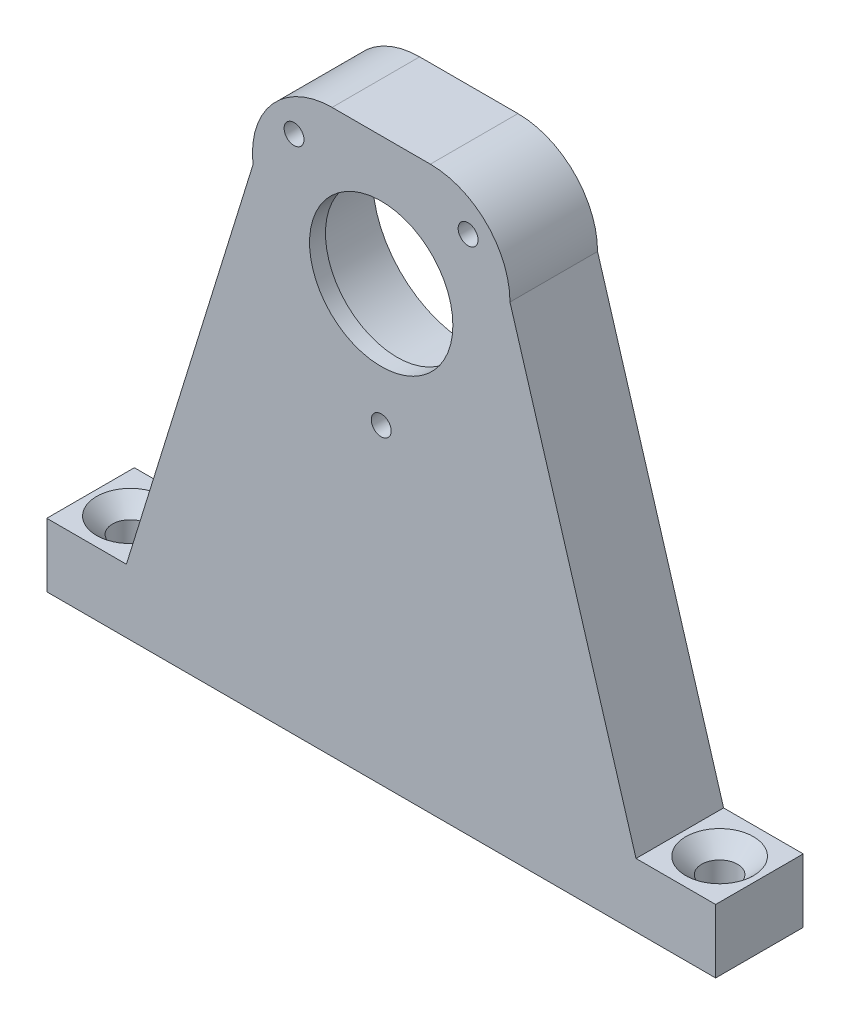
ISO-10303-21;
HEADER;
FILE_DESCRIPTION(('STEP AP214'),'2;1');
FILE_NAME('part.step','',(''),(''),'','','');
FILE_SCHEMA(('AUTOMOTIVE_DESIGN { 1 0 10303 214 1 1 1 1 }'));
ENDSEC;
DATA;
#1=APPLICATION_CONTEXT('core data for automotive mechanical design processes');
#2=APPLICATION_PROTOCOL_DEFINITION('international standard','automotive_design',2000,#1);
#3=PRODUCT_CONTEXT('',#1,'mechanical');
#4=PRODUCT('Part','Part','',(#3));
#5=PRODUCT_RELATED_PRODUCT_CATEGORY('part','',(#4));
#6=PRODUCT_DEFINITION_FORMATION('','',#4);
#7=PRODUCT_DEFINITION_CONTEXT('part definition',#1,'design');
#8=PRODUCT_DEFINITION('design','',#6,#7);
#9=PRODUCT_DEFINITION_SHAPE('','',#8);
#10=(LENGTH_UNIT() NAMED_UNIT(*) SI_UNIT(.MILLI.,.METRE.));
#11=(NAMED_UNIT(*) PLANE_ANGLE_UNIT() SI_UNIT($,.RADIAN.));
#12=(NAMED_UNIT(*) SI_UNIT($,.STERADIAN.) SOLID_ANGLE_UNIT());
#13=UNCERTAINTY_MEASURE_WITH_UNIT(LENGTH_MEASURE(1.E-05),#10,'distance_accuracy_value','');
#14=(GEOMETRIC_REPRESENTATION_CONTEXT(3) GLOBAL_UNCERTAINTY_ASSIGNED_CONTEXT((#13)) GLOBAL_UNIT_ASSIGNED_CONTEXT((#10,
#11,#12)) REPRESENTATION_CONTEXT('',''));
#15=CARTESIAN_POINT('',(0.,0.,0.));
#16=DIRECTION('',(0.,0.,1.));
#17=DIRECTION('',(1.,0.,0.));
#18=AXIS2_PLACEMENT_3D('',#15,#16,#17);
#19=CARTESIAN_POINT('',(0.,0.,11.));
#20=DIRECTION('',(0.,0.,-1.));
#21=DIRECTION('',(-1.,0.,0.));
#22=AXIS2_PLACEMENT_3D('',#19,#20,#21);
#23=CYLINDRICAL_SURFACE('',#22,12.1);
#24=CARTESIAN_POINT('',(0.,0.,0.));
#25=DIRECTION('',(0.,0.,1.));
#26=DIRECTION('',(1.,0.,0.));
#27=AXIS2_PLACEMENT_3D('',#24,#25,#26);
#28=CIRCLE('',#27,12.1);
#29=CARTESIAN_POINT('',(12.1,0.,0.));
#30=VERTEX_POINT('',#29);
#31=EDGE_CURVE('E158',#30,#30,#28,.T.);
#32=ORIENTED_EDGE('',*,*,#31,.F.);
#33=EDGE_LOOP('',(#32));
#34=FACE_BOUND('',#33,.T.);
#35=CARTESIAN_POINT('',(0.,0.,9.));
#36=DIRECTION('',(0.,0.,1.));
#37=DIRECTION('',(1.,0.,0.));
#38=AXIS2_PLACEMENT_3D('',#35,#36,#37);
#39=CIRCLE('',#38,12.1);
#40=CARTESIAN_POINT('',(12.1,0.,9.));
#41=VERTEX_POINT('',#40);
#42=EDGE_CURVE('E303',#41,#41,#39,.T.);
#43=ORIENTED_EDGE('',*,*,#42,.T.);
#44=EDGE_LOOP('',(#43));
#45=FACE_BOUND('',#44,.T.);
#46=ADVANCED_FACE('F38',(#34,#45),#23,.F.);
#47=CARTESIAN_POINT('',(6.17131132464449,6.1,11.));
#48=DIRECTION('',(0.,0.,1.));
#49=DIRECTION('',(1.,0.,0.));
#50=AXIS2_PLACEMENT_3D('',#47,#48,#49);
#51=PLANE('',#50);
#52=CARTESIAN_POINT('',(10.9107197436623,10.8519646008193,11.));
#53=DIRECTION('',(0.,0.,-1.));
#54=DIRECTION('',(-1.,0.,0.));
#55=AXIS2_PLACEMENT_3D('',#52,#53,#54);
#56=CIRCLE('',#55,1.25);
#57=CARTESIAN_POINT('',(9.66071974366226,10.8519646008193,11.));
#58=VERTEX_POINT('',#57);
#59=EDGE_CURVE('E316',#58,#58,#56,.T.);
#60=ORIENTED_EDGE('',*,*,#59,.T.);
#61=EDGE_LOOP('',(#60));
#62=FACE_BOUND('',#61,.T.);
#63=CARTESIAN_POINT('',(-10.9444590620381,10.8179926058548,11.));
#64=DIRECTION('',(0.,0.,-1.));
#65=DIRECTION('',(-1.,0.,0.));
#66=AXIS2_PLACEMENT_3D('',#63,#64,#65);
#67=CIRCLE('',#66,1.25);
#68=CARTESIAN_POINT('',(-12.1944590620381,10.8179926058548,11.));
#69=VERTEX_POINT('',#68);
#70=EDGE_CURVE('E328',#69,#69,#67,.T.);
#71=ORIENTED_EDGE('',*,*,#70,.T.);
#72=EDGE_LOOP('',(#71));
#73=FACE_BOUND('',#72,.T.);
#74=CARTESIAN_POINT('',(0.,-15.3885977601007,11.));
#75=DIRECTION('',(0.,0.,-1.));
#76=DIRECTION('',(-1.,0.,0.));
#77=AXIS2_PLACEMENT_3D('',#74,#75,#76);
#78=CIRCLE('',#77,1.25);
#79=CARTESIAN_POINT('',(-1.25,-15.3885977601007,11.));
#80=VERTEX_POINT('',#79);
#81=EDGE_CURVE('E322',#80,#80,#78,.T.);
#82=ORIENTED_EDGE('',*,*,#81,.T.);
#83=EDGE_LOOP('',(#82));
#84=FACE_BOUND('',#83,.T.);
#85=DIRECTION('',(1.,0.,0.));
#86=VECTOR('',#85,1.);
#87=CARTESIAN_POINT('',(17.,-54.5,11.));
#88=LINE('',#87,#86);
#89=CARTESIAN_POINT('',(-42.,-54.5,11.));
#90=VERTEX_POINT('',#89);
#91=CARTESIAN_POINT('',(42.,-54.5,11.));
#92=VERTEX_POINT('',#91);
#93=EDGE_CURVE('E56',#90,#92,#88,.T.);
#94=ORIENTED_EDGE('',*,*,#93,.T.);
#95=DIRECTION('',(0.,1.,0.));
#96=VECTOR('',#95,1.);
#97=CARTESIAN_POINT('',(42.,-54.5,11.));
#98=LINE('',#97,#96);
#99=CARTESIAN_POINT('',(42.,-46.5,11.));
#100=VERTEX_POINT('',#99);
#101=EDGE_CURVE('E108',#92,#100,#98,.T.);
#102=ORIENTED_EDGE('',*,*,#101,.T.);
#103=DIRECTION('',(-1.,0.,0.));
#104=VECTOR('',#103,1.);
#105=CARTESIAN_POINT('',(42.,-46.5,11.));
#106=LINE('',#105,#104);
#107=CARTESIAN_POINT('',(32.,-46.5,11.));
#108=VERTEX_POINT('',#107);
#109=EDGE_CURVE('E281',#100,#108,#106,.T.);
#110=ORIENTED_EDGE('',*,*,#109,.T.);
#111=DIRECTION('',(-0.288160971359315,0.957581983218803,0.));
#112=VECTOR('',#111,1.);
#113=CARTESIAN_POINT('',(32.,-46.5,11.));
#114=LINE('',#113,#112);
#115=CARTESIAN_POINT('',(16.1713113246445,6.09999999999993,11.));
#116=VERTEX_POINT('',#115);
#117=EDGE_CURVE('E293',#108,#116,#114,.T.);
#118=ORIENTED_EDGE('',*,*,#117,.T.);
#119=CARTESIAN_POINT('',(6.17131132464449,6.1,11.));
#120=DIRECTION('',(0.,0.,1.));
#121=DIRECTION('',(1.,0.,0.));
#122=AXIS2_PLACEMENT_3D('',#119,#120,#121);
#123=CIRCLE('',#122,10.);
#124=CARTESIAN_POINT('',(6.17131132464449,16.1,11.));
#125=VERTEX_POINT('',#124);
#126=EDGE_CURVE('E290',#116,#125,#123,.T.);
#127=ORIENTED_EDGE('',*,*,#126,.T.);
#128=DIRECTION('',(-1.,0.,0.));
#129=VECTOR('',#128,1.);
#130=CARTESIAN_POINT('',(-6.17131132464449,16.1,11.));
#131=LINE('',#130,#129);
#132=CARTESIAN_POINT('',(-6.17131132464449,16.1,11.));
#133=VERTEX_POINT('',#132);
#134=EDGE_CURVE('E292',#125,#133,#131,.T.);
#135=ORIENTED_EDGE('',*,*,#134,.T.);
#136=CARTESIAN_POINT('',(-6.17131132464449,6.1,11.));
#137=DIRECTION('',(0.,0.,1.));
#138=DIRECTION('',(-1.,0.,0.));
#139=AXIS2_PLACEMENT_3D('',#136,#137,#138);
#140=CIRCLE('',#139,10.);
#141=CARTESIAN_POINT('',(-16.1,4.90788373559151,11.));
#142=VERTEX_POINT('',#141);
#143=EDGE_CURVE('E135',#133,#142,#140,.T.);
#144=ORIENTED_EDGE('',*,*,#143,.T.);
#145=DIRECTION('',(-0.295480824322665,-0.95534867062115,0.));
#146=VECTOR('',#145,1.);
#147=CARTESIAN_POINT('',(-32.,-46.5,11.));
#148=LINE('',#147,#146);
#149=CARTESIAN_POINT('',(-32.,-46.5,11.));
#150=VERTEX_POINT('',#149);
#151=EDGE_CURVE('E128',#142,#150,#148,.T.);
#152=ORIENTED_EDGE('',*,*,#151,.T.);
#153=DIRECTION('',(-1.,0.,0.));
#154=VECTOR('',#153,1.);
#155=CARTESIAN_POINT('',(-42.,-46.5,11.));
#156=LINE('',#155,#154);
#157=CARTESIAN_POINT('',(-42.,-46.5,11.));
#158=VERTEX_POINT('',#157);
#159=EDGE_CURVE('E133',#150,#158,#156,.T.);
#160=ORIENTED_EDGE('',*,*,#159,.T.);
#161=DIRECTION('',(0.,-1.,0.));
#162=VECTOR('',#161,1.);
#163=CARTESIAN_POINT('',(-42.,-54.5,11.));
#164=LINE('',#163,#162);
#165=EDGE_CURVE('E149',#158,#90,#164,.T.);
#166=ORIENTED_EDGE('',*,*,#165,.T.);
#167=EDGE_LOOP('',(#94,#102,#110,#118,#127,#135,#144,#152,#160,#166));
#168=FACE_BOUND('',#167,.T.);
#169=CARTESIAN_POINT('',(0.,0.,11.));
#170=DIRECTION('',(0.,0.,1.));
#171=DIRECTION('',(1.,0.,0.));
#172=AXIS2_PLACEMENT_3D('',#169,#170,#171);
#173=CIRCLE('',#172,9.);
#174=CARTESIAN_POINT('',(9.,0.,11.));
#175=VERTEX_POINT('',#174);
#176=EDGE_CURVE('E307',#175,#175,#173,.T.);
#177=ORIENTED_EDGE('',*,*,#176,.F.);
#178=EDGE_LOOP('',(#177));
#179=FACE_BOUND('',#178,.T.);
#180=ADVANCED_FACE('F130',(#62,#73,#84,#168,#179),#51,.T.);
#181=CARTESIAN_POINT('',(6.17131132464449,6.1,0.));
#182=DIRECTION('',(0.,0.,1.));
#183=DIRECTION('',(1.,0.,0.));
#184=AXIS2_PLACEMENT_3D('',#181,#182,#183);
#185=PLANE('',#184);
#186=CARTESIAN_POINT('',(10.9107197436623,10.8519646008193,0.));
#187=DIRECTION('',(0.,0.,-1.));
#188=DIRECTION('',(-1.,0.,0.));
#189=AXIS2_PLACEMENT_3D('',#186,#187,#188);
#190=CIRCLE('',#189,1.25);
#191=CARTESIAN_POINT('',(9.66071974366226,10.8519646008193,0.));
#192=VERTEX_POINT('',#191);
#193=EDGE_CURVE('E331',#192,#192,#190,.T.);
#194=ORIENTED_EDGE('',*,*,#193,.F.);
#195=EDGE_LOOP('',(#194));
#196=FACE_BOUND('',#195,.T.);
#197=CARTESIAN_POINT('',(-10.9444590620381,10.8179926058548,0.));
#198=DIRECTION('',(0.,0.,-1.));
#199=DIRECTION('',(-1.,0.,0.));
#200=AXIS2_PLACEMENT_3D('',#197,#198,#199);
#201=CIRCLE('',#200,1.25);
#202=CARTESIAN_POINT('',(-12.1944590620381,10.8179926058548,0.));
#203=VERTEX_POINT('',#202);
#204=EDGE_CURVE('E325',#203,#203,#201,.T.);
#205=ORIENTED_EDGE('',*,*,#204,.F.);
#206=EDGE_LOOP('',(#205));
#207=FACE_BOUND('',#206,.T.);
#208=CARTESIAN_POINT('',(0.,-15.3885977601007,0.));
#209=DIRECTION('',(0.,0.,-1.));
#210=DIRECTION('',(-1.,0.,0.));
#211=AXIS2_PLACEMENT_3D('',#208,#209,#210);
#212=CIRCLE('',#211,1.25);
#213=CARTESIAN_POINT('',(-1.25,-15.3885977601007,0.));
#214=VERTEX_POINT('',#213);
#215=EDGE_CURVE('E319',#214,#214,#212,.T.);
#216=ORIENTED_EDGE('',*,*,#215,.F.);
#217=EDGE_LOOP('',(#216));
#218=FACE_BOUND('',#217,.T.);
#219=DIRECTION('',(0.,1.,0.));
#220=VECTOR('',#219,1.);
#221=CARTESIAN_POINT('',(42.,-54.5,0.));
#222=LINE('',#221,#220);
#223=CARTESIAN_POINT('',(42.,-54.5,0.));
#224=VERTEX_POINT('',#223);
#225=CARTESIAN_POINT('',(42.,-46.5,0.));
#226=VERTEX_POINT('',#225);
#227=EDGE_CURVE('E155',#224,#226,#222,.T.);
#228=ORIENTED_EDGE('',*,*,#227,.F.);
#229=DIRECTION('',(1.,0.,0.));
#230=VECTOR('',#229,1.);
#231=CARTESIAN_POINT('',(-17.,-54.5,0.));
#232=LINE('',#231,#230);
#233=CARTESIAN_POINT('',(-42.,-54.5,0.));
#234=VERTEX_POINT('',#233);
#235=EDGE_CURVE('E99',#234,#224,#232,.T.);
#236=ORIENTED_EDGE('',*,*,#235,.F.);
#237=DIRECTION('',(0.,-1.,0.));
#238=VECTOR('',#237,1.);
#239=CARTESIAN_POINT('',(-42.,-54.5,0.));
#240=LINE('',#239,#238);
#241=CARTESIAN_POINT('',(-42.,-46.5,0.));
#242=VERTEX_POINT('',#241);
#243=EDGE_CURVE('E170',#242,#234,#240,.T.);
#244=ORIENTED_EDGE('',*,*,#243,.F.);
#245=DIRECTION('',(-1.,0.,0.));
#246=VECTOR('',#245,1.);
#247=CARTESIAN_POINT('',(-42.,-46.5,0.));
#248=LINE('',#247,#246);
#249=CARTESIAN_POINT('',(-32.,-46.5,0.));
#250=VERTEX_POINT('',#249);
#251=EDGE_CURVE('E92',#250,#242,#248,.T.);
#252=ORIENTED_EDGE('',*,*,#251,.F.);
#253=DIRECTION('',(-0.295480824322665,-0.95534867062115,0.));
#254=VECTOR('',#253,1.);
#255=CARTESIAN_POINT('',(-32.,-46.5,0.));
#256=LINE('',#255,#254);
#257=CARTESIAN_POINT('',(-16.1,4.90788373559151,0.));
#258=VERTEX_POINT('',#257);
#259=EDGE_CURVE('E143',#258,#250,#256,.T.);
#260=ORIENTED_EDGE('',*,*,#259,.F.);
#261=CARTESIAN_POINT('',(-6.17131132464449,6.1,0.));
#262=DIRECTION('',(0.,0.,1.));
#263=DIRECTION('',(-1.,0.,0.));
#264=AXIS2_PLACEMENT_3D('',#261,#262,#263);
#265=CIRCLE('',#264,10.);
#266=CARTESIAN_POINT('',(-6.17131132464449,16.1,0.));
#267=VERTEX_POINT('',#266);
#268=EDGE_CURVE('E166',#267,#258,#265,.T.);
#269=ORIENTED_EDGE('',*,*,#268,.F.);
#270=DIRECTION('',(-1.,0.,0.));
#271=VECTOR('',#270,1.);
#272=CARTESIAN_POINT('',(-6.17131132464449,16.1,0.));
#273=LINE('',#272,#271);
#274=CARTESIAN_POINT('',(6.17131132464449,16.1,0.));
#275=VERTEX_POINT('',#274);
#276=EDGE_CURVE('E164',#275,#267,#273,.T.);
#277=ORIENTED_EDGE('',*,*,#276,.F.);
#278=CARTESIAN_POINT('',(6.17131132464449,6.1,0.));
#279=DIRECTION('',(0.,0.,1.));
#280=DIRECTION('',(1.,0.,0.));
#281=AXIS2_PLACEMENT_3D('',#278,#279,#280);
#282=CIRCLE('',#281,10.);
#283=CARTESIAN_POINT('',(16.1713113246445,6.09999999999993,0.));
#284=VERTEX_POINT('',#283);
#285=EDGE_CURVE('E162',#284,#275,#282,.T.);
#286=ORIENTED_EDGE('',*,*,#285,.F.);
#287=DIRECTION('',(-0.288160971359315,0.957581983218803,0.));
#288=VECTOR('',#287,1.);
#289=CARTESIAN_POINT('',(32.,-46.5,0.));
#290=LINE('',#289,#288);
#291=CARTESIAN_POINT('',(32.,-46.5,0.));
#292=VERTEX_POINT('',#291);
#293=EDGE_CURVE('E160',#292,#284,#290,.T.);
#294=ORIENTED_EDGE('',*,*,#293,.F.);
#295=DIRECTION('',(-1.,0.,0.));
#296=VECTOR('',#295,1.);
#297=CARTESIAN_POINT('',(42.,-46.5,0.));
#298=LINE('',#297,#296);
#299=EDGE_CURVE('E157',#226,#292,#298,.T.);
#300=ORIENTED_EDGE('',*,*,#299,.F.);
#301=EDGE_LOOP('',(#228,#236,#244,#252,#260,#269,#277,#286,#294,#300));
#302=FACE_BOUND('',#301,.T.);
#303=ORIENTED_EDGE('',*,*,#31,.T.);
#304=EDGE_LOOP('',(#303));
#305=FACE_BOUND('',#304,.T.);
#306=ADVANCED_FACE('F223',(#196,#207,#218,#302,#305),#185,.F.);
#307=CARTESIAN_POINT('',(42.,-54.5,11.));
#308=DIRECTION('',(-1.,0.,0.));
#309=DIRECTION('',(0.,0.,1.));
#310=AXIS2_PLACEMENT_3D('',#307,#308,#309);
#311=PLANE('',#310);
#312=ORIENTED_EDGE('',*,*,#227,.T.);
#313=DIRECTION('',(0.,0.,-1.));
#314=VECTOR('',#313,1.);
#315=CARTESIAN_POINT('',(42.,-46.5,11.));
#316=LINE('',#315,#314);
#317=EDGE_CURVE('E188',#100,#226,#316,.T.);
#318=ORIENTED_EDGE('',*,*,#317,.F.);
#319=ORIENTED_EDGE('',*,*,#101,.F.);
#320=DIRECTION('',(0.,0.,-1.));
#321=VECTOR('',#320,1.);
#322=CARTESIAN_POINT('',(42.,-54.5,11.));
#323=LINE('',#322,#321);
#324=EDGE_CURVE('E191',#92,#224,#323,.T.);
#325=ORIENTED_EDGE('',*,*,#324,.T.);
#326=EDGE_LOOP('',(#312,#318,#319,#325));
#327=FACE_BOUND('',#326,.T.);
#328=ADVANCED_FACE('F234',(#327),#311,.F.);
#329=CARTESIAN_POINT('',(42.,-46.5,11.));
#330=DIRECTION('',(0.,-1.,0.));
#331=DIRECTION('',(0.,0.,-1.));
#332=AXIS2_PLACEMENT_3D('',#329,#330,#331);
#333=PLANE('',#332);
#334=CARTESIAN_POINT('',(37.,-46.5,5.5));
#335=DIRECTION('',(0.,-1.,0.));
#336=DIRECTION('',(0.,0.,-1.));
#337=AXIS2_PLACEMENT_3D('',#334,#335,#336);
#338=CIRCLE('',#337,4.25000000000005);
#339=CARTESIAN_POINT('',(37.,-46.5,1.24999999999995));
#340=VERTEX_POINT('',#339);
#341=EDGE_CURVE('E11',#340,#340,#338,.T.);
#342=ORIENTED_EDGE('',*,*,#341,.T.);
#343=EDGE_LOOP('',(#342));
#344=FACE_BOUND('',#343,.T.);
#345=ORIENTED_EDGE('',*,*,#299,.T.);
#346=DIRECTION('',(0.,0.,-1.));
#347=VECTOR('',#346,1.);
#348=CARTESIAN_POINT('',(32.,-46.5,11.));
#349=LINE('',#348,#347);
#350=EDGE_CURVE('E185',#108,#292,#349,.T.);
#351=ORIENTED_EDGE('',*,*,#350,.F.);
#352=ORIENTED_EDGE('',*,*,#109,.F.);
#353=ORIENTED_EDGE('',*,*,#317,.T.);
#354=EDGE_LOOP('',(#345,#351,#352,#353));
#355=FACE_BOUND('',#354,.T.);
#356=ADVANCED_FACE('F264',(#344,#355),#333,.F.);
#357=CARTESIAN_POINT('',(32.,-46.5,11.));
#358=DIRECTION('',(-0.957581983218803,-0.288160971359315,0.));
#359=DIRECTION('',(0.288160971359315,-0.957581983218803,0.));
#360=AXIS2_PLACEMENT_3D('',#357,#358,#359);
#361=PLANE('',#360);
#362=ORIENTED_EDGE('',*,*,#293,.T.);
#363=DIRECTION('',(0.,0.,-1.));
#364=VECTOR('',#363,1.);
#365=CARTESIAN_POINT('',(16.1713113246445,6.09999999999993,11.));
#366=LINE('',#365,#364);
#367=EDGE_CURVE('E182',#116,#284,#366,.T.);
#368=ORIENTED_EDGE('',*,*,#367,.F.);
#369=ORIENTED_EDGE('',*,*,#117,.F.);
#370=ORIENTED_EDGE('',*,*,#350,.T.);
#371=EDGE_LOOP('',(#362,#368,#369,#370));
#372=FACE_BOUND('',#371,.T.);
#373=ADVANCED_FACE('F260',(#372),#361,.F.);
#374=CARTESIAN_POINT('',(6.17131132464449,6.1,11.));
#375=DIRECTION('',(0.,0.,-1.));
#376=DIRECTION('',(-1.,0.,0.));
#377=AXIS2_PLACEMENT_3D('',#374,#375,#376);
#378=CYLINDRICAL_SURFACE('',#377,10.);
#379=ORIENTED_EDGE('',*,*,#285,.T.);
#380=DIRECTION('',(0.,0.,-1.));
#381=VECTOR('',#380,1.);
#382=CARTESIAN_POINT('',(6.17131132464449,16.1,11.));
#383=LINE('',#382,#381);
#384=EDGE_CURVE('E179',#125,#275,#383,.T.);
#385=ORIENTED_EDGE('',*,*,#384,.F.);
#386=ORIENTED_EDGE('',*,*,#126,.F.);
#387=ORIENTED_EDGE('',*,*,#367,.T.);
#388=EDGE_LOOP('',(#379,#385,#386,#387));
#389=FACE_BOUND('',#388,.T.);
#390=ADVANCED_FACE('F256',(#389),#378,.T.);
#391=CARTESIAN_POINT('',(-6.17131132464449,16.1,11.));
#392=DIRECTION('',(0.,-1.,0.));
#393=DIRECTION('',(0.,0.,-1.));
#394=AXIS2_PLACEMENT_3D('',#391,#392,#393);
#395=PLANE('',#394);
#396=ORIENTED_EDGE('',*,*,#276,.T.);
#397=DIRECTION('',(0.,0.,-1.));
#398=VECTOR('',#397,1.);
#399=CARTESIAN_POINT('',(-6.17131132464449,16.1,11.));
#400=LINE('',#399,#398);
#401=EDGE_CURVE('E176',#133,#267,#400,.T.);
#402=ORIENTED_EDGE('',*,*,#401,.F.);
#403=ORIENTED_EDGE('',*,*,#134,.F.);
#404=ORIENTED_EDGE('',*,*,#384,.T.);
#405=EDGE_LOOP('',(#396,#402,#403,#404));
#406=FACE_BOUND('',#405,.T.);
#407=ADVANCED_FACE('F252',(#406),#395,.F.);
#408=CARTESIAN_POINT('',(-6.17131132464449,6.1,11.));
#409=DIRECTION('',(0.,0.,-1.));
#410=DIRECTION('',(-1.,0.,0.));
#411=AXIS2_PLACEMENT_3D('',#408,#409,#410);
#412=CYLINDRICAL_SURFACE('',#411,10.);
#413=ORIENTED_EDGE('',*,*,#268,.T.);
#414=DIRECTION('',(0.,0.,-1.));
#415=VECTOR('',#414,1.);
#416=CARTESIAN_POINT('',(-16.1,4.90788373559151,11.));
#417=LINE('',#416,#415);
#418=EDGE_CURVE('E144',#142,#258,#417,.T.);
#419=ORIENTED_EDGE('',*,*,#418,.F.);
#420=ORIENTED_EDGE('',*,*,#143,.F.);
#421=ORIENTED_EDGE('',*,*,#401,.T.);
#422=EDGE_LOOP('',(#413,#419,#420,#421));
#423=FACE_BOUND('',#422,.T.);
#424=ADVANCED_FACE('F249',(#423),#412,.T.);
#425=CARTESIAN_POINT('',(-32.,-46.5,11.));
#426=DIRECTION('',(0.95534867062115,-0.295480824322665,0.));
#427=DIRECTION('',(0.295480824322665,0.95534867062115,0.));
#428=AXIS2_PLACEMENT_3D('',#425,#426,#427);
#429=PLANE('',#428);
#430=ORIENTED_EDGE('',*,*,#259,.T.);
#431=DIRECTION('',(0.,0.,-1.));
#432=VECTOR('',#431,1.);
#433=CARTESIAN_POINT('',(-32.,-46.5,11.));
#434=LINE('',#433,#432);
#435=EDGE_CURVE('E140',#150,#250,#434,.T.);
#436=ORIENTED_EDGE('',*,*,#435,.F.);
#437=ORIENTED_EDGE('',*,*,#151,.F.);
#438=ORIENTED_EDGE('',*,*,#418,.T.);
#439=EDGE_LOOP('',(#430,#436,#437,#438));
#440=FACE_BOUND('',#439,.T.);
#441=ADVANCED_FACE('F141',(#440),#429,.F.);
#442=CARTESIAN_POINT('',(-42.,-46.5,11.));
#443=DIRECTION('',(0.,-1.,0.));
#444=DIRECTION('',(0.,0.,-1.));
#445=AXIS2_PLACEMENT_3D('',#442,#443,#444);
#446=PLANE('',#445);
#447=CARTESIAN_POINT('',(-37.,-46.5,5.5));
#448=DIRECTION('',(0.,-1.,0.));
#449=DIRECTION('',(0.,0.,-1.));
#450=AXIS2_PLACEMENT_3D('',#447,#448,#449);
#451=CIRCLE('',#450,4.25000000000005);
#452=CARTESIAN_POINT('',(-37.,-46.5,1.24999999999995));
#453=VERTEX_POINT('',#452);
#454=EDGE_CURVE('E196',#453,#453,#451,.T.);
#455=ORIENTED_EDGE('',*,*,#454,.T.);
#456=EDGE_LOOP('',(#455));
#457=FACE_BOUND('',#456,.T.);
#458=ORIENTED_EDGE('',*,*,#251,.T.);
#459=DIRECTION('',(0.,0.,-1.));
#460=VECTOR('',#459,1.);
#461=CARTESIAN_POINT('',(-42.,-46.5,11.));
#462=LINE('',#461,#460);
#463=EDGE_CURVE('E145',#158,#242,#462,.T.);
#464=ORIENTED_EDGE('',*,*,#463,.F.);
#465=ORIENTED_EDGE('',*,*,#159,.F.);
#466=ORIENTED_EDGE('',*,*,#435,.T.);
#467=EDGE_LOOP('',(#458,#464,#465,#466));
#468=FACE_BOUND('',#467,.T.);
#469=ADVANCED_FACE('F147',(#457,#468),#446,.F.);
#470=CARTESIAN_POINT('',(-42.,-54.5,11.));
#471=DIRECTION('',(1.,0.,0.));
#472=DIRECTION('',(0.,0.,-1.));
#473=AXIS2_PLACEMENT_3D('',#470,#471,#472);
#474=PLANE('',#473);
#475=ORIENTED_EDGE('',*,*,#243,.T.);
#476=DIRECTION('',(0.,0.,-1.));
#477=VECTOR('',#476,1.);
#478=CARTESIAN_POINT('',(-42.,-54.5,11.));
#479=LINE('',#478,#477);
#480=EDGE_CURVE('E151',#90,#234,#479,.T.);
#481=ORIENTED_EDGE('',*,*,#480,.F.);
#482=ORIENTED_EDGE('',*,*,#165,.F.);
#483=ORIENTED_EDGE('',*,*,#463,.T.);
#484=EDGE_LOOP('',(#475,#481,#482,#483));
#485=FACE_BOUND('',#484,.T.);
#486=ADVANCED_FACE('F239',(#485),#474,.F.);
#487=CARTESIAN_POINT('',(-17.,-54.5,11.));
#488=DIRECTION('',(0.,1.,0.));
#489=DIRECTION('',(0.,0.,1.));
#490=AXIS2_PLACEMENT_3D('',#487,#488,#489);
#491=PLANE('',#490);
#492=CARTESIAN_POINT('',(37.,-54.5,5.5));
#493=DIRECTION('',(0.,1.,0.));
#494=DIRECTION('',(0.,0.,1.));
#495=AXIS2_PLACEMENT_3D('',#492,#493,#494);
#496=CIRCLE('',#495,2.25);
#497=CARTESIAN_POINT('',(37.,-54.5,7.75));
#498=VERTEX_POINT('',#497);
#499=EDGE_CURVE('E310',#498,#498,#496,.T.);
#500=ORIENTED_EDGE('',*,*,#499,.T.);
#501=EDGE_LOOP('',(#500));
#502=FACE_BOUND('',#501,.T.);
#503=CARTESIAN_POINT('',(-37.,-54.5,5.5));
#504=DIRECTION('',(0.,1.,0.));
#505=DIRECTION('',(0.,0.,1.));
#506=AXIS2_PLACEMENT_3D('',#503,#504,#505);
#507=CIRCLE('',#506,2.25);
#508=CARTESIAN_POINT('',(-37.,-54.5,7.75));
#509=VERTEX_POINT('',#508);
#510=EDGE_CURVE('E313',#509,#509,#507,.T.);
#511=ORIENTED_EDGE('',*,*,#510,.T.);
#512=EDGE_LOOP('',(#511));
#513=FACE_BOUND('',#512,.T.);
#514=ORIENTED_EDGE('',*,*,#235,.T.);
#515=ORIENTED_EDGE('',*,*,#324,.F.);
#516=ORIENTED_EDGE('',*,*,#93,.F.);
#517=ORIENTED_EDGE('',*,*,#480,.T.);
#518=EDGE_LOOP('',(#514,#515,#516,#517));
#519=FACE_BOUND('',#518,.T.);
#520=ADVANCED_FACE('F236',(#502,#513,#519),#491,.F.);
#521=CARTESIAN_POINT('',(0.,0.,9.));
#522=DIRECTION('',(0.,0.,1.));
#523=DIRECTION('',(1.,0.,0.));
#524=AXIS2_PLACEMENT_3D('',#521,#522,#523);
#525=PLANE('',#524);
#526=CARTESIAN_POINT('',(0.,0.,9.));
#527=DIRECTION('',(0.,0.,1.));
#528=DIRECTION('',(1.,0.,0.));
#529=AXIS2_PLACEMENT_3D('',#526,#527,#528);
#530=CIRCLE('',#529,9.);
#531=CARTESIAN_POINT('',(9.,0.,9.));
#532=VERTEX_POINT('',#531);
#533=EDGE_CURVE('E306',#532,#532,#530,.T.);
#534=ORIENTED_EDGE('',*,*,#533,.T.);
#535=EDGE_LOOP('',(#534));
#536=FACE_BOUND('',#535,.T.);
#537=ORIENTED_EDGE('',*,*,#42,.F.);
#538=EDGE_LOOP('',(#537));
#539=FACE_BOUND('',#538,.T.);
#540=ADVANCED_FACE('F229',(#536,#539),#525,.F.);
#541=CARTESIAN_POINT('',(0.,0.,9.));
#542=DIRECTION('',(0.,0.,1.));
#543=DIRECTION('',(1.,0.,0.));
#544=AXIS2_PLACEMENT_3D('',#541,#542,#543);
#545=CYLINDRICAL_SURFACE('',#544,9.);
#546=ORIENTED_EDGE('',*,*,#533,.F.);
#547=EDGE_LOOP('',(#546));
#548=FACE_BOUND('',#547,.T.);
#549=ORIENTED_EDGE('',*,*,#176,.T.);
#550=EDGE_LOOP('',(#549));
#551=FACE_BOUND('',#550,.T.);
#552=ADVANCED_FACE('F360',(#548,#551),#545,.F.);
#553=CARTESIAN_POINT('',(-37.,-54.5,5.5));
#554=DIRECTION('',(0.,1.,0.));
#555=DIRECTION('',(0.,0.,1.));
#556=AXIS2_PLACEMENT_3D('',#553,#554,#555);
#557=CYLINDRICAL_SURFACE('',#556,2.25);
#558=CARTESIAN_POINT('',(-37.,-48.5,5.5));
#559=DIRECTION('',(0.,-1.,0.));
#560=DIRECTION('',(0.,0.,-1.));
#561=AXIS2_PLACEMENT_3D('',#558,#559,#560);
#562=CIRCLE('',#561,2.25);
#563=CARTESIAN_POINT('',(-37.,-48.5,3.25));
#564=VERTEX_POINT('',#563);
#565=EDGE_CURVE('E193',#564,#564,#562,.F.);
#566=ORIENTED_EDGE('',*,*,#565,.T.);
#567=EDGE_LOOP('',(#566));
#568=FACE_BOUND('',#567,.T.);
#569=ORIENTED_EDGE('',*,*,#510,.F.);
#570=EDGE_LOOP('',(#569));
#571=FACE_BOUND('',#570,.T.);
#572=ADVANCED_FACE('F358',(#568,#571),#557,.F.);
#573=CARTESIAN_POINT('',(37.,-54.5,5.5));
#574=DIRECTION('',(0.,1.,0.));
#575=DIRECTION('',(0.,0.,1.));
#576=AXIS2_PLACEMENT_3D('',#573,#574,#575);
#577=CYLINDRICAL_SURFACE('',#576,2.25);
#578=CARTESIAN_POINT('',(37.,-48.5,5.5));
#579=DIRECTION('',(0.,-1.,0.));
#580=DIRECTION('',(0.,0.,-1.));
#581=AXIS2_PLACEMENT_3D('',#578,#579,#580);
#582=CIRCLE('',#581,2.25);
#583=CARTESIAN_POINT('',(37.,-48.5,3.25));
#584=VERTEX_POINT('',#583);
#585=EDGE_CURVE('E48',#584,#584,#582,.F.);
#586=ORIENTED_EDGE('',*,*,#585,.T.);
#587=EDGE_LOOP('',(#586));
#588=FACE_BOUND('',#587,.T.);
#589=ORIENTED_EDGE('',*,*,#499,.F.);
#590=EDGE_LOOP('',(#589));
#591=FACE_BOUND('',#590,.T.);
#592=ADVANCED_FACE('F201',(#588,#591),#577,.F.);
#593=CARTESIAN_POINT('',(-37.,-48.5,5.5));
#594=DIRECTION('',(0.,1.,0.));
#595=DIRECTION('',(0.,0.,1.));
#596=AXIS2_PLACEMENT_3D('',#593,#594,#595);
#597=CONICAL_SURFACE('',#596,2.25,0.78539816339745);
#598=ORIENTED_EDGE('',*,*,#454,.F.);
#599=EDGE_LOOP('',(#598));
#600=FACE_BOUND('',#599,.T.);
#601=ORIENTED_EDGE('',*,*,#565,.F.);
#602=EDGE_LOOP('',(#601));
#603=FACE_BOUND('',#602,.T.);
#604=ADVANCED_FACE('F206',(#600,#603),#597,.F.);
#605=CARTESIAN_POINT('',(37.,-48.5,5.5));
#606=DIRECTION('',(0.,1.,0.));
#607=DIRECTION('',(0.,0.,1.));
#608=AXIS2_PLACEMENT_3D('',#605,#606,#607);
#609=CONICAL_SURFACE('',#608,2.25,0.78539816339745);
#610=ORIENTED_EDGE('',*,*,#341,.F.);
#611=EDGE_LOOP('',(#610));
#612=FACE_BOUND('',#611,.T.);
#613=ORIENTED_EDGE('',*,*,#585,.F.);
#614=EDGE_LOOP('',(#613));
#615=FACE_BOUND('',#614,.T.);
#616=ADVANCED_FACE('F41',(#612,#615),#609,.F.);
#617=CARTESIAN_POINT('',(0.,-15.3885977601007,11.));
#618=DIRECTION('',(0.,0.,-1.));
#619=DIRECTION('',(-1.,0.,0.));
#620=AXIS2_PLACEMENT_3D('',#617,#618,#619);
#621=CYLINDRICAL_SURFACE('',#620,1.25);
#622=ORIENTED_EDGE('',*,*,#81,.F.);
#623=EDGE_LOOP('',(#622));
#624=FACE_BOUND('',#623,.T.);
#625=ORIENTED_EDGE('',*,*,#215,.T.);
#626=EDGE_LOOP('',(#625));
#627=FACE_BOUND('',#626,.T.);
#628=ADVANCED_FACE('F205',(#624,#627),#621,.F.);
#629=CARTESIAN_POINT('',(-10.9444590620381,10.8179926058548,11.));
#630=DIRECTION('',(0.,0.,-1.));
#631=DIRECTION('',(-1.,0.,0.));
#632=AXIS2_PLACEMENT_3D('',#629,#630,#631);
#633=CYLINDRICAL_SURFACE('',#632,1.25);
#634=ORIENTED_EDGE('',*,*,#70,.F.);
#635=EDGE_LOOP('',(#634));
#636=FACE_BOUND('',#635,.T.);
#637=ORIENTED_EDGE('',*,*,#204,.T.);
#638=EDGE_LOOP('',(#637));
#639=FACE_BOUND('',#638,.T.);
#640=ADVANCED_FACE('F212',(#636,#639),#633,.F.);
#641=CARTESIAN_POINT('',(10.9107197436623,10.8519646008193,11.));
#642=DIRECTION('',(0.,0.,-1.));
#643=DIRECTION('',(-1.,0.,0.));
#644=AXIS2_PLACEMENT_3D('',#641,#642,#643);
#645=CYLINDRICAL_SURFACE('',#644,1.25);
#646=ORIENTED_EDGE('',*,*,#59,.F.);
#647=EDGE_LOOP('',(#646));
#648=FACE_BOUND('',#647,.T.);
#649=ORIENTED_EDGE('',*,*,#193,.T.);
#650=EDGE_LOOP('',(#649));
#651=FACE_BOUND('',#650,.T.);
#652=ADVANCED_FACE('F338',(#648,#651),#645,.F.);
#653=CLOSED_SHELL('',(#46,#180,#306,#328,#356,#373,#390,#407,#424,#441,#469,#486,#520,#540,#552,
#572,#592,#604,#616,#628,#640,#652));
#654=MANIFOLD_SOLID_BREP('B2',#653);
#655=ADVANCED_BREP_SHAPE_REPRESENTATION('',(#18,#654),#14);
#656=SHAPE_DEFINITION_REPRESENTATION(#9,#655);
ENDSEC;
END-ISO-10303-21;
